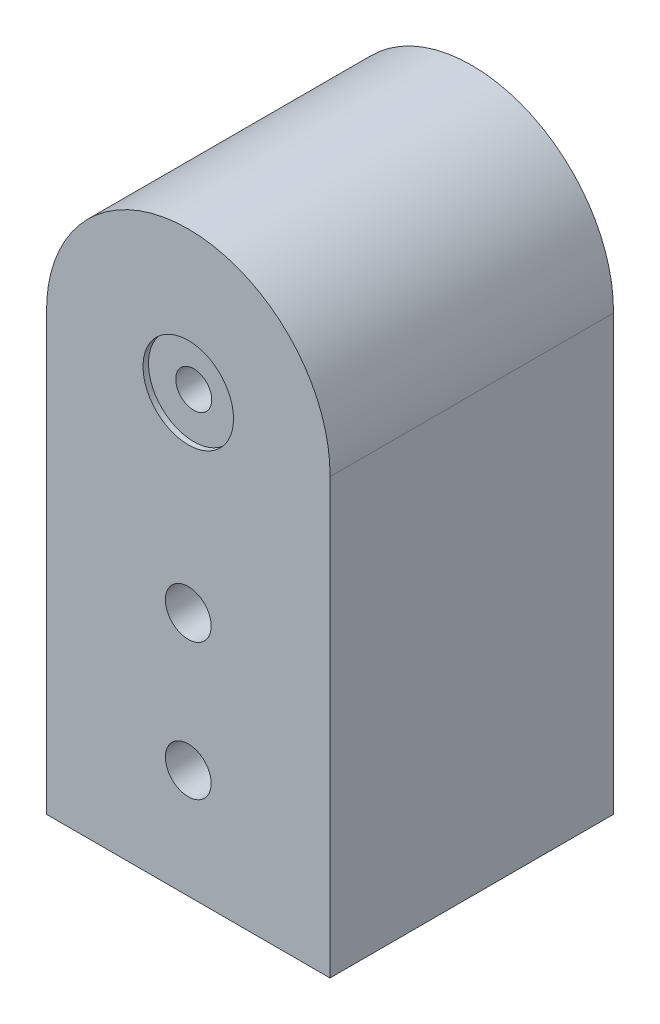
ISO-10303-21;
HEADER;
FILE_DESCRIPTION(('STEP AP214'),'2;1');
FILE_NAME('part.step','',(''),(''),'','','');
FILE_SCHEMA(('AUTOMOTIVE_DESIGN { 1 0 10303 214 1 1 1 1 }'));
ENDSEC;
DATA;
#1=APPLICATION_CONTEXT('core data for automotive mechanical design processes');
#2=APPLICATION_PROTOCOL_DEFINITION('international standard','automotive_design',2000,#1);
#3=PRODUCT_CONTEXT('',#1,'mechanical');
#4=PRODUCT('Part','Part','',(#3));
#5=PRODUCT_RELATED_PRODUCT_CATEGORY('part','',(#4));
#6=PRODUCT_DEFINITION_FORMATION('','',#4);
#7=PRODUCT_DEFINITION_CONTEXT('part definition',#1,'design');
#8=PRODUCT_DEFINITION('design','',#6,#7);
#9=PRODUCT_DEFINITION_SHAPE('','',#8);
#10=(LENGTH_UNIT() NAMED_UNIT(*) SI_UNIT(.MILLI.,.METRE.));
#11=(NAMED_UNIT(*) PLANE_ANGLE_UNIT() SI_UNIT($,.RADIAN.));
#12=(NAMED_UNIT(*) SI_UNIT($,.STERADIAN.) SOLID_ANGLE_UNIT());
#13=UNCERTAINTY_MEASURE_WITH_UNIT(LENGTH_MEASURE(1.E-05),#10,'distance_accuracy_value','');
#14=(GEOMETRIC_REPRESENTATION_CONTEXT(3) GLOBAL_UNCERTAINTY_ASSIGNED_CONTEXT((#13)) GLOBAL_UNIT_ASSIGNED_CONTEXT((#10,
#11,#12)) REPRESENTATION_CONTEXT('',''));
#15=CARTESIAN_POINT('',(0.,0.,0.));
#16=DIRECTION('',(0.,0.,1.));
#17=DIRECTION('',(1.,0.,0.));
#18=AXIS2_PLACEMENT_3D('',#15,#16,#17);
#19=CARTESIAN_POINT('',(13.,40.,0.));
#20=DIRECTION('',(0.,0.,1.));
#21=DIRECTION('',(1.,0.,0.));
#22=AXIS2_PLACEMENT_3D('',#19,#20,#21);
#23=CYLINDRICAL_SURFACE('',#22,1.65);
#24=CARTESIAN_POINT('',(13.,40.,25.5));
#25=DIRECTION('',(0.,0.,1.));
#26=DIRECTION('',(1.,0.,0.));
#27=AXIS2_PLACEMENT_3D('',#24,#25,#26);
#28=CIRCLE('',#27,1.65);
#29=CARTESIAN_POINT('',(14.65,40.,25.5));
#30=VERTEX_POINT('',#29);
#31=EDGE_CURVE('E150',#30,#30,#28,.T.);
#32=CARTESIAN_POINT('',(13.,40.,0.5));
#33=DIRECTION('',(0.,0.,-1.));
#34=DIRECTION('',(-1.,0.,0.));
#35=AXIS2_PLACEMENT_3D('',#32,#33,#34);
#36=CIRCLE('',#35,1.65);
#37=CARTESIAN_POINT('',(14.65,40.,0.5));
#38=VERTEX_POINT('',#37);
#39=EDGE_CURVE('E143',#38,#38,#36,.T.);
#40=CARTESIAN_POINT('',(14.65,40.,25.5));
#41=CARTESIAN_POINT('',(14.65,40.,25.2395833333333));
#42=CARTESIAN_POINT('',(14.65,40.,24.9791666666667));
#43=CARTESIAN_POINT('',(14.65,40.,24.4583333333333));
#44=CARTESIAN_POINT('',(14.65,40.,24.1979166666667));
#45=CARTESIAN_POINT('',(14.65,40.,23.6770833333333));
#46=CARTESIAN_POINT('',(14.65,40.,23.4166666666667));
#47=CARTESIAN_POINT('',(14.65,40.,22.8958333333333));
#48=CARTESIAN_POINT('',(14.65,40.,22.6354166666667));
#49=CARTESIAN_POINT('',(14.65,40.,22.1145833333333));
#50=CARTESIAN_POINT('',(14.65,40.,21.8541666666667));
#51=CARTESIAN_POINT('',(14.65,40.,21.3333333333333));
#52=CARTESIAN_POINT('',(14.65,40.,21.0729166666667));
#53=CARTESIAN_POINT('',(14.65,40.,20.5520833333333));
#54=CARTESIAN_POINT('',(14.65,40.,20.2916666666667));
#55=CARTESIAN_POINT('',(14.65,40.,19.7708333333333));
#56=CARTESIAN_POINT('',(14.65,40.,19.5104166666667));
#57=CARTESIAN_POINT('',(14.65,40.,18.9895833333333));
#58=CARTESIAN_POINT('',(14.65,40.,18.7291666666667));
#59=CARTESIAN_POINT('',(14.65,40.,18.2083333333333));
#60=CARTESIAN_POINT('',(14.65,40.,17.9479166666667));
#61=CARTESIAN_POINT('',(14.65,40.,17.4270833333333));
#62=CARTESIAN_POINT('',(14.65,40.,17.1666666666667));
#63=CARTESIAN_POINT('',(14.65,40.,16.6458333333333));
#64=CARTESIAN_POINT('',(14.65,40.,16.3854166666667));
#65=CARTESIAN_POINT('',(14.65,40.,15.8645833333333));
#66=CARTESIAN_POINT('',(14.65,40.,15.6041666666667));
#67=CARTESIAN_POINT('',(14.65,40.,15.0833333333333));
#68=CARTESIAN_POINT('',(14.65,40.,14.8229166666667));
#69=CARTESIAN_POINT('',(14.65,40.,14.3020833333333));
#70=CARTESIAN_POINT('',(14.65,40.,14.0416666666667));
#71=CARTESIAN_POINT('',(14.65,40.,13.5208333333333));
#72=CARTESIAN_POINT('',(14.65,40.,13.2604166666667));
#73=CARTESIAN_POINT('',(14.65,40.,12.7395833333333));
#74=CARTESIAN_POINT('',(14.65,40.,12.4791666666667));
#75=CARTESIAN_POINT('',(14.65,40.,11.9583333333333));
#76=CARTESIAN_POINT('',(14.65,40.,11.6979166666667));
#77=CARTESIAN_POINT('',(14.65,40.,11.1770833333333));
#78=CARTESIAN_POINT('',(14.65,40.,10.9166666666667));
#79=CARTESIAN_POINT('',(14.65,40.,10.3958333333333));
#80=CARTESIAN_POINT('',(14.65,40.,10.1354166666667));
#81=CARTESIAN_POINT('',(14.65,40.,9.61458333333333));
#82=CARTESIAN_POINT('',(14.65,40.,9.35416666666667));
#83=CARTESIAN_POINT('',(14.65,40.,8.83333333333333));
#84=CARTESIAN_POINT('',(14.65,40.,8.57291666666667));
#85=CARTESIAN_POINT('',(14.65,40.,8.05208333333333));
#86=CARTESIAN_POINT('',(14.65,40.,7.79166666666667));
#87=CARTESIAN_POINT('',(14.65,40.,7.27083333333333));
#88=CARTESIAN_POINT('',(14.65,40.,7.01041666666667));
#89=CARTESIAN_POINT('',(14.65,40.,6.48958333333333));
#90=CARTESIAN_POINT('',(14.65,40.,6.22916666666667));
#91=CARTESIAN_POINT('',(14.65,40.,5.70833333333333));
#92=CARTESIAN_POINT('',(14.65,40.,5.44791666666667));
#93=CARTESIAN_POINT('',(14.65,40.,4.92708333333333));
#94=CARTESIAN_POINT('',(14.65,40.,4.66666666666667));
#95=CARTESIAN_POINT('',(14.65,40.,4.14583333333333));
#96=CARTESIAN_POINT('',(14.65,40.,3.88541666666667));
#97=CARTESIAN_POINT('',(14.65,40.,3.36458333333333));
#98=CARTESIAN_POINT('',(14.65,40.,3.10416666666667));
#99=CARTESIAN_POINT('',(14.65,40.,2.58333333333333));
#100=CARTESIAN_POINT('',(14.65,40.,2.32291666666667));
#101=CARTESIAN_POINT('',(14.65,40.,1.80208333333333));
#102=CARTESIAN_POINT('',(14.65,40.,1.54166666666667));
#103=CARTESIAN_POINT('',(14.65,40.,1.02083333333333));
#104=CARTESIAN_POINT('',(14.65,40.,0.760416666666668));
#105=CARTESIAN_POINT('',(14.65,40.,0.5));
#106=B_SPLINE_CURVE_WITH_KNOTS('',3,(#40,#41,#42,#43,#44,#45,#46,#47,#48,#49,#50,#51,#52,#53,
#54,#55,#56,#57,#58,#59,#60,#61,#62,#63,#64,#65,#66,#67,#68,#69,#70,#71,#72,#73,#74,#75,#76,#77,
#78,#79,#80,#81,#82,#83,#84,#85,#86,#87,#88,#89,#90,#91,#92,#93,#94,#95,#96,#97,#98,#99,#100,
#101,#102,#103,#104,#105),.UNSPECIFIED.,.F.,.F.,(4,2,2,2,2,2,2,2,2,2,2,2,2,2,2,2,2,2,2,2,2,2,2,
2,2,2,2,2,2,2,2,2,4),(0.,0.781250000000001,1.5625,2.34375,3.125,3.90625,4.6875,5.46875,6.25,
7.03125,7.8125,8.59375,9.375,10.15625,10.9375,11.71875,12.5,13.28125,14.0625,14.84375,15.625,
16.40625,17.1875,17.96875,18.75,19.53125,20.3125,21.09375,21.875,22.65625,23.4375,24.21875,25.),.UNSPECIFIED.);
#107=EDGE_CURVE('BSEAM34',#30,#38,#106,.T.);
#108=ORIENTED_EDGE('',*,*,#31,.T.);
#109=ORIENTED_EDGE('',*,*,#39,.T.);
#110=ORIENTED_EDGE('',*,*,#107,.T.);
#111=ORIENTED_EDGE('',*,*,#107,.F.);
#112=EDGE_LOOP('',(#108,#110,#109,#111));
#113=FACE_BOUND('',#112,.T.);
#114=ADVANCED_FACE('F34',(#113),#23,.F.);
#115=CARTESIAN_POINT('',(26.,0.,26.));
#116=DIRECTION('',(0.,1.,0.));
#117=DIRECTION('',(0.,0.,1.));
#118=AXIS2_PLACEMENT_3D('',#115,#116,#117);
#119=PLANE('',#118);
#120=DIRECTION('',(1.,0.,0.));
#121=VECTOR('',#120,1.);
#122=CARTESIAN_POINT('',(3.,0.,3.));
#123=LINE('',#122,#121);
#124=CARTESIAN_POINT('',(3.,0.,3.));
#125=VERTEX_POINT('',#124);
#126=CARTESIAN_POINT('',(23.,0.,3.));
#127=VERTEX_POINT('',#126);
#128=EDGE_CURVE('E176',#125,#127,#123,.T.);
#129=ORIENTED_EDGE('',*,*,#128,.F.);
#130=DIRECTION('',(0.,0.,-1.));
#131=VECTOR('',#130,1.);
#132=CARTESIAN_POINT('',(3.,0.,23.));
#133=LINE('',#132,#131);
#134=CARTESIAN_POINT('',(3.,0.,23.));
#135=VERTEX_POINT('',#134);
#136=EDGE_CURVE('E57',#135,#125,#133,.T.);
#137=ORIENTED_EDGE('',*,*,#136,.F.);
#138=DIRECTION('',(-1.,0.,0.));
#139=VECTOR('',#138,1.);
#140=CARTESIAN_POINT('',(3.,0.,23.));
#141=LINE('',#140,#139);
#142=CARTESIAN_POINT('',(23.,0.,23.));
#143=VERTEX_POINT('',#142);
#144=EDGE_CURVE('E165',#143,#135,#141,.T.);
#145=ORIENTED_EDGE('',*,*,#144,.F.);
#146=DIRECTION('',(0.,0.,1.));
#147=VECTOR('',#146,1.);
#148=CARTESIAN_POINT('',(23.,0.,23.));
#149=LINE('',#148,#147);
#150=EDGE_CURVE('E179',#127,#143,#149,.T.);
#151=ORIENTED_EDGE('',*,*,#150,.F.);
#152=EDGE_LOOP('',(#129,#137,#145,#151));
#153=FACE_BOUND('',#152,.T.);
#154=DIRECTION('',(1.,0.,0.));
#155=VECTOR('',#154,1.);
#156=CARTESIAN_POINT('',(26.,0.,0.));
#157=LINE('',#156,#155);
#158=CARTESIAN_POINT('',(0.,0.,0.));
#159=VERTEX_POINT('',#158);
#160=CARTESIAN_POINT('',(26.,0.,0.));
#161=VERTEX_POINT('',#160);
#162=EDGE_CURVE('E186',#159,#161,#157,.T.);
#163=ORIENTED_EDGE('',*,*,#162,.T.);
#164=DIRECTION('',(0.,0.,-1.));
#165=VECTOR('',#164,1.);
#166=CARTESIAN_POINT('',(26.,0.,26.));
#167=LINE('',#166,#165);
#168=CARTESIAN_POINT('',(26.,0.,26.));
#169=VERTEX_POINT('',#168);
#170=EDGE_CURVE('E42',#169,#161,#167,.T.);
#171=ORIENTED_EDGE('',*,*,#170,.F.);
#172=DIRECTION('',(1.,0.,0.));
#173=VECTOR('',#172,1.);
#174=CARTESIAN_POINT('',(26.,0.,26.));
#175=LINE('',#174,#173);
#176=CARTESIAN_POINT('',(0.,0.,26.));
#177=VERTEX_POINT('',#176);
#178=EDGE_CURVE('E192',#177,#169,#175,.T.);
#179=ORIENTED_EDGE('',*,*,#178,.F.);
#180=DIRECTION('',(0.,0.,-1.));
#181=VECTOR('',#180,1.);
#182=CARTESIAN_POINT('',(0.,0.,26.));
#183=LINE('',#182,#181);
#184=EDGE_CURVE('E104',#177,#159,#183,.T.);
#185=ORIENTED_EDGE('',*,*,#184,.T.);
#186=EDGE_LOOP('',(#163,#171,#179,#185));
#187=FACE_BOUND('',#186,.T.);
#188=ADVANCED_FACE('F36',(#153,#187),#119,.F.);
#189=CARTESIAN_POINT('',(26.,30.,26.));
#190=DIRECTION('',(-1.,0.,0.));
#191=DIRECTION('',(0.,0.,1.));
#192=AXIS2_PLACEMENT_3D('',#189,#190,#191);
#193=PLANE('',#192);
#194=DIRECTION('',(0.,1.,0.));
#195=VECTOR('',#194,1.);
#196=CARTESIAN_POINT('',(26.,30.,0.));
#197=LINE('',#196,#195);
#198=CARTESIAN_POINT('',(26.,39.8219336489554,0.));
#199=VERTEX_POINT('',#198);
#200=EDGE_CURVE('E197',#161,#199,#197,.T.);
#201=ORIENTED_EDGE('',*,*,#200,.T.);
#202=DIRECTION('',(0.,0.,1.));
#203=VECTOR('',#202,1.);
#204=CARTESIAN_POINT('',(26.,39.8219336489554,-41.));
#205=LINE('',#204,#203);
#206=CARTESIAN_POINT('',(26.,39.8219336489554,26.));
#207=VERTEX_POINT('',#206);
#208=EDGE_CURVE('E116',#199,#207,#205,.T.);
#209=ORIENTED_EDGE('',*,*,#208,.T.);
#210=DIRECTION('',(0.,1.,0.));
#211=VECTOR('',#210,1.);
#212=CARTESIAN_POINT('',(26.,30.,26.));
#213=LINE('',#212,#211);
#214=EDGE_CURVE('E109',#169,#207,#213,.T.);
#215=ORIENTED_EDGE('',*,*,#214,.F.);
#216=ORIENTED_EDGE('',*,*,#170,.T.);
#217=EDGE_LOOP('',(#201,#209,#215,#216));
#218=FACE_BOUND('',#217,.T.);
#219=ADVANCED_FACE('F235',(#218),#193,.F.);
#220=CARTESIAN_POINT('',(0.,0.,26.));
#221=DIRECTION('',(1.,0.,0.));
#222=DIRECTION('',(0.,0.,-1.));
#223=AXIS2_PLACEMENT_3D('',#220,#221,#222);
#224=PLANE('',#223);
#225=DIRECTION('',(0.,-1.,0.));
#226=VECTOR('',#225,1.);
#227=CARTESIAN_POINT('',(0.,0.,0.));
#228=LINE('',#227,#226);
#229=CARTESIAN_POINT('',(0.,39.821933648956,0.));
#230=VERTEX_POINT('',#229);
#231=EDGE_CURVE('E49',#230,#159,#228,.T.);
#232=ORIENTED_EDGE('',*,*,#231,.T.);
#233=ORIENTED_EDGE('',*,*,#184,.F.);
#234=DIRECTION('',(0.,-1.,0.));
#235=VECTOR('',#234,1.);
#236=CARTESIAN_POINT('',(0.,0.,26.));
#237=LINE('',#236,#235);
#238=CARTESIAN_POINT('',(0.,39.821933648956,26.));
#239=VERTEX_POINT('',#238);
#240=EDGE_CURVE('E99',#239,#177,#237,.T.);
#241=ORIENTED_EDGE('',*,*,#240,.F.);
#242=DIRECTION('',(0.,0.,1.));
#243=VECTOR('',#242,1.);
#244=CARTESIAN_POINT('',(0.,39.821933648956,-41.));
#245=LINE('',#244,#243);
#246=EDGE_CURVE('E102',#230,#239,#245,.T.);
#247=ORIENTED_EDGE('',*,*,#246,.F.);
#248=EDGE_LOOP('',(#232,#233,#241,#247));
#249=FACE_BOUND('',#248,.T.);
#250=ADVANCED_FACE('F101',(#249),#224,.F.);
#251=CARTESIAN_POINT('',(13.,40.,26.));
#252=DIRECTION('',(0.,0.,-1.));
#253=DIRECTION('',(-1.,0.,0.));
#254=AXIS2_PLACEMENT_3D('',#251,#252,#253);
#255=PLANE('',#254);
#256=CARTESIAN_POINT('',(13.,22.5,26.));
#257=DIRECTION('',(0.,0.,1.));
#258=DIRECTION('',(1.,0.,0.));
#259=AXIS2_PLACEMENT_3D('',#256,#257,#258);
#260=CIRCLE('',#259,2.1);
#261=CARTESIAN_POINT('',(15.1,22.5,26.));
#262=VERTEX_POINT('',#261);
#263=EDGE_CURVE('E128',#262,#262,#260,.T.);
#264=ORIENTED_EDGE('',*,*,#263,.F.);
#265=EDGE_LOOP('',(#264));
#266=FACE_BOUND('',#265,.T.);
#267=CARTESIAN_POINT('',(13.,10.,26.));
#268=DIRECTION('',(0.,0.,1.));
#269=DIRECTION('',(1.,0.,0.));
#270=AXIS2_PLACEMENT_3D('',#267,#268,#269);
#271=CIRCLE('',#270,2.1);
#272=CARTESIAN_POINT('',(15.1,10.,26.));
#273=VERTEX_POINT('',#272);
#274=EDGE_CURVE('E122',#273,#273,#271,.T.);
#275=ORIENTED_EDGE('',*,*,#274,.F.);
#276=EDGE_LOOP('',(#275));
#277=FACE_BOUND('',#276,.T.);
#278=CARTESIAN_POINT('',(13.,40.,26.));
#279=DIRECTION('',(0.,0.,1.));
#280=DIRECTION('',(1.,0.,0.));
#281=AXIS2_PLACEMENT_3D('',#278,#279,#280);
#282=CIRCLE('',#281,4.15);
#283=CARTESIAN_POINT('',(17.15,40.,26.));
#284=VERTEX_POINT('',#283);
#285=EDGE_CURVE('E155',#284,#284,#282,.T.);
#286=ORIENTED_EDGE('',*,*,#285,.F.);
#287=EDGE_LOOP('',(#286));
#288=FACE_BOUND('',#287,.T.);
#289=ORIENTED_EDGE('',*,*,#214,.T.);
#290=CARTESIAN_POINT('',(13.,40.,26.));
#291=DIRECTION('',(0.,0.,-1.));
#292=DIRECTION('',(1.,0.,0.));
#293=AXIS2_PLACEMENT_3D('',#290,#291,#292);
#294=CIRCLE('',#293,13.0012194668567);
#295=EDGE_CURVE('E115',#239,#207,#294,.T.);
#296=ORIENTED_EDGE('',*,*,#295,.F.);
#297=ORIENTED_EDGE('',*,*,#240,.T.);
#298=ORIENTED_EDGE('',*,*,#178,.T.);
#299=EDGE_LOOP('',(#289,#296,#297,#298));
#300=FACE_BOUND('',#299,.T.);
#301=ADVANCED_FACE('F118',(#266,#277,#288,#300),#255,.F.);
#302=CARTESIAN_POINT('',(13.,40.,0.));
#303=DIRECTION('',(0.,0.,-1.));
#304=DIRECTION('',(-1.,0.,0.));
#305=AXIS2_PLACEMENT_3D('',#302,#303,#304);
#306=PLANE('',#305);
#307=CARTESIAN_POINT('',(13.,40.,0.));
#308=DIRECTION('',(0.,0.,-1.));
#309=DIRECTION('',(-1.,0.,0.));
#310=AXIS2_PLACEMENT_3D('',#307,#308,#309);
#311=CIRCLE('',#310,13.0012194668567);
#312=EDGE_CURVE('E11',#199,#230,#311,.F.);
#313=ORIENTED_EDGE('',*,*,#312,.F.);
#314=ORIENTED_EDGE('',*,*,#200,.F.);
#315=ORIENTED_EDGE('',*,*,#162,.F.);
#316=ORIENTED_EDGE('',*,*,#231,.F.);
#317=EDGE_LOOP('',(#313,#314,#315,#316));
#318=FACE_BOUND('',#317,.T.);
#319=CARTESIAN_POINT('',(13.,22.5,0.));
#320=DIRECTION('',(0.,0.,1.));
#321=DIRECTION('',(1.,0.,0.));
#322=AXIS2_PLACEMENT_3D('',#319,#320,#321);
#323=CIRCLE('',#322,2.1);
#324=CARTESIAN_POINT('',(15.1,22.5,0.));
#325=VERTEX_POINT('',#324);
#326=EDGE_CURVE('E124',#325,#325,#323,.T.);
#327=ORIENTED_EDGE('',*,*,#326,.T.);
#328=EDGE_LOOP('',(#327));
#329=FACE_BOUND('',#328,.T.);
#330=CARTESIAN_POINT('',(13.,10.,0.));
#331=DIRECTION('',(0.,0.,1.));
#332=DIRECTION('',(1.,0.,0.));
#333=AXIS2_PLACEMENT_3D('',#330,#331,#332);
#334=CIRCLE('',#333,2.1);
#335=CARTESIAN_POINT('',(15.1,10.,0.));
#336=VERTEX_POINT('',#335);
#337=EDGE_CURVE('E131',#336,#336,#334,.T.);
#338=ORIENTED_EDGE('',*,*,#337,.T.);
#339=EDGE_LOOP('',(#338));
#340=FACE_BOUND('',#339,.T.);
#341=CARTESIAN_POINT('',(13.,40.,0.));
#342=DIRECTION('',(0.,0.,-1.));
#343=DIRECTION('',(-1.,0.,0.));
#344=AXIS2_PLACEMENT_3D('',#341,#342,#343);
#345=CIRCLE('',#344,4.15);
#346=CARTESIAN_POINT('',(8.85,40.,0.));
#347=VERTEX_POINT('',#346);
#348=EDGE_CURVE('E146',#347,#347,#345,.T.);
#349=ORIENTED_EDGE('',*,*,#348,.F.);
#350=EDGE_LOOP('',(#349));
#351=FACE_BOUND('',#350,.T.);
#352=ADVANCED_FACE('F259',(#318,#329,#340,#351),#306,.T.);
#353=CARTESIAN_POINT('',(3.,30.,23.));
#354=DIRECTION('',(-1.,0.,0.));
#355=DIRECTION('',(0.,0.,1.));
#356=AXIS2_PLACEMENT_3D('',#353,#354,#355);
#357=PLANE('',#356);
#358=ORIENTED_EDGE('',*,*,#136,.T.);
#359=DIRECTION('',(0.,-1.,0.));
#360=VECTOR('',#359,1.);
#361=CARTESIAN_POINT('',(3.,30.,3.));
#362=LINE('',#361,#360);
#363=CARTESIAN_POINT('',(3.,30.,3.));
#364=VERTEX_POINT('',#363);
#365=EDGE_CURVE('E174',#364,#125,#362,.T.);
#366=ORIENTED_EDGE('',*,*,#365,.F.);
#367=DIRECTION('',(0.,0.,-1.));
#368=VECTOR('',#367,1.);
#369=CARTESIAN_POINT('',(3.,30.,23.));
#370=LINE('',#369,#368);
#371=CARTESIAN_POINT('',(3.,30.,23.));
#372=VERTEX_POINT('',#371);
#373=EDGE_CURVE('E161',#372,#364,#370,.T.);
#374=ORIENTED_EDGE('',*,*,#373,.F.);
#375=DIRECTION('',(0.,-1.,0.));
#376=VECTOR('',#375,1.);
#377=CARTESIAN_POINT('',(3.,30.,23.));
#378=LINE('',#377,#376);
#379=EDGE_CURVE('E184',#372,#135,#378,.T.);
#380=ORIENTED_EDGE('',*,*,#379,.T.);
#381=EDGE_LOOP('',(#358,#366,#374,#380));
#382=FACE_BOUND('',#381,.T.);
#383=ADVANCED_FACE('F250',(#382),#357,.F.);
#384=CARTESIAN_POINT('',(3.,30.,23.));
#385=DIRECTION('',(0.,0.,1.));
#386=DIRECTION('',(1.,0.,0.));
#387=AXIS2_PLACEMENT_3D('',#384,#385,#386);
#388=PLANE('',#387);
#389=CARTESIAN_POINT('',(13.,22.5,23.));
#390=DIRECTION('',(0.,0.,1.));
#391=DIRECTION('',(1.,0.,0.));
#392=AXIS2_PLACEMENT_3D('',#389,#390,#391);
#393=CIRCLE('',#392,2.1);
#394=CARTESIAN_POINT('',(15.1,22.5,23.));
#395=VERTEX_POINT('',#394);
#396=EDGE_CURVE('E140',#395,#395,#393,.T.);
#397=ORIENTED_EDGE('',*,*,#396,.T.);
#398=EDGE_LOOP('',(#397));
#399=FACE_BOUND('',#398,.T.);
#400=CARTESIAN_POINT('',(13.,10.,23.));
#401=DIRECTION('',(0.,0.,1.));
#402=DIRECTION('',(1.,0.,0.));
#403=AXIS2_PLACEMENT_3D('',#400,#401,#402);
#404=CIRCLE('',#403,2.1);
#405=CARTESIAN_POINT('',(15.1,10.,23.));
#406=VERTEX_POINT('',#405);
#407=EDGE_CURVE('E136',#406,#406,#404,.T.);
#408=ORIENTED_EDGE('',*,*,#407,.T.);
#409=EDGE_LOOP('',(#408));
#410=FACE_BOUND('',#409,.T.);
#411=ORIENTED_EDGE('',*,*,#144,.T.);
#412=ORIENTED_EDGE('',*,*,#379,.F.);
#413=DIRECTION('',(-1.,0.,0.));
#414=VECTOR('',#413,1.);
#415=CARTESIAN_POINT('',(3.,30.,23.));
#416=LINE('',#415,#414);
#417=CARTESIAN_POINT('',(23.,30.,23.));
#418=VERTEX_POINT('',#417);
#419=EDGE_CURVE('E171',#418,#372,#416,.T.);
#420=ORIENTED_EDGE('',*,*,#419,.F.);
#421=DIRECTION('',(0.,-1.,0.));
#422=VECTOR('',#421,1.);
#423=CARTESIAN_POINT('',(23.,30.,23.));
#424=LINE('',#423,#422);
#425=EDGE_CURVE('E187',#418,#143,#424,.T.);
#426=ORIENTED_EDGE('',*,*,#425,.T.);
#427=EDGE_LOOP('',(#411,#412,#420,#426));
#428=FACE_BOUND('',#427,.T.);
#429=ADVANCED_FACE('F246',(#399,#410,#428),#388,.F.);
#430=CARTESIAN_POINT('',(23.,30.,23.));
#431=DIRECTION('',(1.,0.,0.));
#432=DIRECTION('',(0.,0.,-1.));
#433=AXIS2_PLACEMENT_3D('',#430,#431,#432);
#434=PLANE('',#433);
#435=ORIENTED_EDGE('',*,*,#150,.T.);
#436=ORIENTED_EDGE('',*,*,#425,.F.);
#437=DIRECTION('',(0.,0.,1.));
#438=VECTOR('',#437,1.);
#439=CARTESIAN_POINT('',(23.,30.,23.));
#440=LINE('',#439,#438);
#441=CARTESIAN_POINT('',(23.,30.,3.));
#442=VERTEX_POINT('',#441);
#443=EDGE_CURVE('E168',#442,#418,#440,.T.);
#444=ORIENTED_EDGE('',*,*,#443,.F.);
#445=DIRECTION('',(0.,-1.,0.));
#446=VECTOR('',#445,1.);
#447=CARTESIAN_POINT('',(23.,30.,3.));
#448=LINE('',#447,#446);
#449=EDGE_CURVE('E189',#442,#127,#448,.T.);
#450=ORIENTED_EDGE('',*,*,#449,.T.);
#451=EDGE_LOOP('',(#435,#436,#444,#450));
#452=FACE_BOUND('',#451,.T.);
#453=ADVANCED_FACE('F249',(#452),#434,.F.);
#454=CARTESIAN_POINT('',(3.,30.,3.));
#455=DIRECTION('',(0.,0.,-1.));
#456=DIRECTION('',(-1.,0.,0.));
#457=AXIS2_PLACEMENT_3D('',#454,#455,#456);
#458=PLANE('',#457);
#459=CARTESIAN_POINT('',(13.,22.5,3.));
#460=DIRECTION('',(0.,0.,-1.));
#461=DIRECTION('',(-1.,0.,0.));
#462=AXIS2_PLACEMENT_3D('',#459,#460,#461);
#463=CIRCLE('',#462,2.1);
#464=CARTESIAN_POINT('',(15.1,22.5,3.));
#465=VERTEX_POINT('',#464);
#466=EDGE_CURVE('E139',#465,#465,#463,.T.);
#467=ORIENTED_EDGE('',*,*,#466,.T.);
#468=EDGE_LOOP('',(#467));
#469=FACE_BOUND('',#468,.T.);
#470=CARTESIAN_POINT('',(13.,10.,3.));
#471=DIRECTION('',(0.,0.,-1.));
#472=DIRECTION('',(-1.,0.,0.));
#473=AXIS2_PLACEMENT_3D('',#470,#471,#472);
#474=CIRCLE('',#473,2.1);
#475=CARTESIAN_POINT('',(15.1,10.,3.));
#476=VERTEX_POINT('',#475);
#477=EDGE_CURVE('E127',#476,#476,#474,.T.);
#478=ORIENTED_EDGE('',*,*,#477,.T.);
#479=EDGE_LOOP('',(#478));
#480=FACE_BOUND('',#479,.T.);
#481=ORIENTED_EDGE('',*,*,#128,.T.);
#482=ORIENTED_EDGE('',*,*,#449,.F.);
#483=DIRECTION('',(1.,0.,0.));
#484=VECTOR('',#483,1.);
#485=CARTESIAN_POINT('',(3.,30.,3.));
#486=LINE('',#485,#484);
#487=EDGE_CURVE('E164',#364,#442,#486,.T.);
#488=ORIENTED_EDGE('',*,*,#487,.F.);
#489=ORIENTED_EDGE('',*,*,#365,.T.);
#490=EDGE_LOOP('',(#481,#482,#488,#489));
#491=FACE_BOUND('',#490,.T.);
#492=ADVANCED_FACE('F207',(#469,#480,#491),#458,.F.);
#493=CARTESIAN_POINT('',(0.,30.,0.));
#494=DIRECTION('',(0.,-1.,0.));
#495=DIRECTION('',(0.,0.,-1.));
#496=AXIS2_PLACEMENT_3D('',#493,#494,#495);
#497=PLANE('',#496);
#498=ORIENTED_EDGE('',*,*,#373,.T.);
#499=ORIENTED_EDGE('',*,*,#487,.T.);
#500=ORIENTED_EDGE('',*,*,#443,.T.);
#501=ORIENTED_EDGE('',*,*,#419,.T.);
#502=EDGE_LOOP('',(#498,#499,#500,#501));
#503=FACE_BOUND('',#502,.T.);
#504=ADVANCED_FACE('F242',(#503),#497,.T.);
#505=CARTESIAN_POINT('',(13.,40.,25.5));
#506=DIRECTION('',(0.,0.,1.));
#507=DIRECTION('',(1.,0.,0.));
#508=AXIS2_PLACEMENT_3D('',#505,#506,#507);
#509=CYLINDRICAL_SURFACE('',#508,4.15);
#510=CARTESIAN_POINT('',(13.,40.,25.5));
#511=DIRECTION('',(0.,0.,1.));
#512=DIRECTION('',(1.,0.,0.));
#513=AXIS2_PLACEMENT_3D('',#510,#511,#512);
#514=CIRCLE('',#513,4.15);
#515=CARTESIAN_POINT('',(17.15,40.,25.5));
#516=VERTEX_POINT('',#515);
#517=EDGE_CURVE('E156',#516,#516,#514,.T.);
#518=ORIENTED_EDGE('',*,*,#517,.F.);
#519=EDGE_LOOP('',(#518));
#520=FACE_BOUND('',#519,.T.);
#521=ORIENTED_EDGE('',*,*,#285,.T.);
#522=EDGE_LOOP('',(#521));
#523=FACE_BOUND('',#522,.T.);
#524=ADVANCED_FACE('F240',(#520,#523),#509,.F.);
#525=CARTESIAN_POINT('',(13.,40.,25.5));
#526=DIRECTION('',(0.,0.,1.));
#527=DIRECTION('',(1.,0.,0.));
#528=AXIS2_PLACEMENT_3D('',#525,#526,#527);
#529=PLANE('',#528);
#530=ORIENTED_EDGE('',*,*,#31,.F.);
#531=EDGE_LOOP('',(#530));
#532=FACE_BOUND('',#531,.T.);
#533=ORIENTED_EDGE('',*,*,#517,.T.);
#534=EDGE_LOOP('',(#533));
#535=FACE_BOUND('',#534,.T.);
#536=ADVANCED_FACE('F279',(#532,#535),#529,.T.);
#537=CARTESIAN_POINT('',(13.,40.,0.5));
#538=DIRECTION('',(0.,0.,-1.));
#539=DIRECTION('',(-1.,0.,0.));
#540=AXIS2_PLACEMENT_3D('',#537,#538,#539);
#541=CYLINDRICAL_SURFACE('',#540,4.15);
#542=CARTESIAN_POINT('',(13.,40.,0.5));
#543=DIRECTION('',(0.,0.,-1.));
#544=DIRECTION('',(-1.,0.,0.));
#545=AXIS2_PLACEMENT_3D('',#542,#543,#544);
#546=CIRCLE('',#545,4.15);
#547=CARTESIAN_POINT('',(8.85,40.,0.5));
#548=VERTEX_POINT('',#547);
#549=EDGE_CURVE('E147',#548,#548,#546,.T.);
#550=ORIENTED_EDGE('',*,*,#549,.F.);
#551=EDGE_LOOP('',(#550));
#552=FACE_BOUND('',#551,.T.);
#553=ORIENTED_EDGE('',*,*,#348,.T.);
#554=EDGE_LOOP('',(#553));
#555=FACE_BOUND('',#554,.T.);
#556=ADVANCED_FACE('F277',(#552,#555),#541,.F.);
#557=CARTESIAN_POINT('',(13.,40.,0.5));
#558=DIRECTION('',(0.,0.,-1.));
#559=DIRECTION('',(-1.,0.,0.));
#560=AXIS2_PLACEMENT_3D('',#557,#558,#559);
#561=PLANE('',#560);
#562=ORIENTED_EDGE('',*,*,#39,.F.);
#563=EDGE_LOOP('',(#562));
#564=FACE_BOUND('',#563,.T.);
#565=ORIENTED_EDGE('',*,*,#549,.T.);
#566=EDGE_LOOP('',(#565));
#567=FACE_BOUND('',#566,.T.);
#568=ADVANCED_FACE('F223',(#564,#567),#561,.T.);
#569=CARTESIAN_POINT('',(13.,10.,0.));
#570=DIRECTION('',(0.,0.,1.));
#571=DIRECTION('',(1.,0.,0.));
#572=AXIS2_PLACEMENT_3D('',#569,#570,#571);
#573=CYLINDRICAL_SURFACE('',#572,2.1);
#574=CARTESIAN_POINT('',(15.1,10.,0.));
#575=CARTESIAN_POINT('',(15.1,10.,0.03125));
#576=CARTESIAN_POINT('',(15.1,10.,0.0625));
#577=CARTESIAN_POINT('',(15.1,10.,0.125));
#578=CARTESIAN_POINT('',(15.1,10.,0.15625));
#579=CARTESIAN_POINT('',(15.1,10.,0.21875));
#580=CARTESIAN_POINT('',(15.1,10.,0.25));
#581=CARTESIAN_POINT('',(15.1,10.,0.3125));
#582=CARTESIAN_POINT('',(15.1,10.,0.34375));
#583=CARTESIAN_POINT('',(15.1,10.,0.40625));
#584=CARTESIAN_POINT('',(15.1,10.,0.4375));
#585=CARTESIAN_POINT('',(15.1,10.,0.5));
#586=CARTESIAN_POINT('',(15.1,10.,0.53125));
#587=CARTESIAN_POINT('',(15.1,10.,0.59375));
#588=CARTESIAN_POINT('',(15.1,10.,0.625));
#589=CARTESIAN_POINT('',(15.1,10.,0.6875));
#590=CARTESIAN_POINT('',(15.1,10.,0.71875));
#591=CARTESIAN_POINT('',(15.1,10.,0.78125));
#592=CARTESIAN_POINT('',(15.1,10.,0.8125));
#593=CARTESIAN_POINT('',(15.1,10.,0.875));
#594=CARTESIAN_POINT('',(15.1,10.,0.90625));
#595=CARTESIAN_POINT('',(15.1,10.,0.96875));
#596=CARTESIAN_POINT('',(15.1,10.,1.));
#597=CARTESIAN_POINT('',(15.1,10.,1.0625));
#598=CARTESIAN_POINT('',(15.1,10.,1.09375));
#599=CARTESIAN_POINT('',(15.1,10.,1.15625));
#600=CARTESIAN_POINT('',(15.1,10.,1.1875));
#601=CARTESIAN_POINT('',(15.1,10.,1.25));
#602=CARTESIAN_POINT('',(15.1,10.,1.28125));
#603=CARTESIAN_POINT('',(15.1,10.,1.34375));
#604=CARTESIAN_POINT('',(15.1,10.,1.375));
#605=CARTESIAN_POINT('',(15.1,10.,1.4375));
#606=CARTESIAN_POINT('',(15.1,10.,1.46875));
#607=CARTESIAN_POINT('',(15.1,10.,1.53125));
#608=CARTESIAN_POINT('',(15.1,10.,1.5625));
#609=CARTESIAN_POINT('',(15.1,10.,1.625));
#610=CARTESIAN_POINT('',(15.1,10.,1.65625));
#611=CARTESIAN_POINT('',(15.1,10.,1.71875));
#612=CARTESIAN_POINT('',(15.1,10.,1.75));
#613=CARTESIAN_POINT('',(15.1,10.,1.8125));
#614=CARTESIAN_POINT('',(15.1,10.,1.84375));
#615=CARTESIAN_POINT('',(15.1,10.,1.90625));
#616=CARTESIAN_POINT('',(15.1,10.,1.9375));
#617=CARTESIAN_POINT('',(15.1,10.,2.));
#618=CARTESIAN_POINT('',(15.1,10.,2.03125));
#619=CARTESIAN_POINT('',(15.1,10.,2.09375));
#620=CARTESIAN_POINT('',(15.1,10.,2.125));
#621=CARTESIAN_POINT('',(15.1,10.,2.1875));
#622=CARTESIAN_POINT('',(15.1,10.,2.21875));
#623=CARTESIAN_POINT('',(15.1,10.,2.28125));
#624=CARTESIAN_POINT('',(15.1,10.,2.3125));
#625=CARTESIAN_POINT('',(15.1,10.,2.375));
#626=CARTESIAN_POINT('',(15.1,10.,2.40625));
#627=CARTESIAN_POINT('',(15.1,10.,2.46875));
#628=CARTESIAN_POINT('',(15.1,10.,2.5));
#629=CARTESIAN_POINT('',(15.1,10.,2.5625));
#630=CARTESIAN_POINT('',(15.1,10.,2.59375));
#631=CARTESIAN_POINT('',(15.1,10.,2.65625));
#632=CARTESIAN_POINT('',(15.1,10.,2.6875));
#633=CARTESIAN_POINT('',(15.1,10.,2.75));
#634=CARTESIAN_POINT('',(15.1,10.,2.78125));
#635=CARTESIAN_POINT('',(15.1,10.,2.84375));
#636=CARTESIAN_POINT('',(15.1,10.,2.875));
#637=CARTESIAN_POINT('',(15.1,10.,2.9375));
#638=CARTESIAN_POINT('',(15.1,10.,2.96875));
#639=CARTESIAN_POINT('',(15.1,10.,3.));
#640=B_SPLINE_CURVE_WITH_KNOTS('',3,(#574,#575,#576,#577,#578,#579,#580,#581,#582,#583,#584,
#585,#586,#587,#588,#589,#590,#591,#592,#593,#594,#595,#596,#597,#598,#599,#600,#601,#602,#603,
#604,#605,#606,#607,#608,#609,#610,#611,#612,#613,#614,#615,#616,#617,#618,#619,#620,#621,#622,
#623,#624,#625,#626,#627,#628,#629,#630,#631,#632,#633,#634,#635,#636,#637,#638,#639),
.UNSPECIFIED.,.F.,.F.,(4,2,2,2,2,2,2,2,2,2,2,2,2,2,2,2,2,2,2,2,2,2,2,2,2,2,2,2,2,2,2,2,4),(0.,
0.09375,0.1875,0.28125,0.375,0.46875,0.5625,0.65625,0.75,0.84375,0.9375,1.03125,1.125,1.21875,
1.3125,1.40625,1.5,1.59375,1.6875,1.78125,1.875,1.96875,2.0625,2.15625,2.25,2.34375,2.4375,
2.53125,2.625,2.71875,2.8125,2.90625,3.),.UNSPECIFIED.);
#641=EDGE_CURVE('BSEAM213',#336,#476,#640,.T.);
#642=ORIENTED_EDGE('',*,*,#337,.F.);
#643=ORIENTED_EDGE('',*,*,#477,.F.);
#644=ORIENTED_EDGE('',*,*,#641,.T.);
#645=ORIENTED_EDGE('',*,*,#641,.F.);
#646=EDGE_LOOP('',(#642,#644,#643,#645));
#647=FACE_BOUND('',#646,.T.);
#648=ADVANCED_FACE('F213',(#647),#573,.F.);
#649=CARTESIAN_POINT('',(13.,22.5,0.));
#650=DIRECTION('',(0.,0.,1.));
#651=DIRECTION('',(1.,0.,0.));
#652=AXIS2_PLACEMENT_3D('',#649,#650,#651);
#653=CYLINDRICAL_SURFACE('',#652,2.1);
#654=CARTESIAN_POINT('',(15.1,22.5,0.));
#655=CARTESIAN_POINT('',(15.1,22.5,0.03125));
#656=CARTESIAN_POINT('',(15.1,22.5,0.0625));
#657=CARTESIAN_POINT('',(15.1,22.5,0.125));
#658=CARTESIAN_POINT('',(15.1,22.5,0.15625));
#659=CARTESIAN_POINT('',(15.1,22.5,0.21875));
#660=CARTESIAN_POINT('',(15.1,22.5,0.25));
#661=CARTESIAN_POINT('',(15.1,22.5,0.3125));
#662=CARTESIAN_POINT('',(15.1,22.5,0.34375));
#663=CARTESIAN_POINT('',(15.1,22.5,0.40625));
#664=CARTESIAN_POINT('',(15.1,22.5,0.4375));
#665=CARTESIAN_POINT('',(15.1,22.5,0.5));
#666=CARTESIAN_POINT('',(15.1,22.5,0.53125));
#667=CARTESIAN_POINT('',(15.1,22.5,0.59375));
#668=CARTESIAN_POINT('',(15.1,22.5,0.625));
#669=CARTESIAN_POINT('',(15.1,22.5,0.6875));
#670=CARTESIAN_POINT('',(15.1,22.5,0.71875));
#671=CARTESIAN_POINT('',(15.1,22.5,0.78125));
#672=CARTESIAN_POINT('',(15.1,22.5,0.8125));
#673=CARTESIAN_POINT('',(15.1,22.5,0.875));
#674=CARTESIAN_POINT('',(15.1,22.5,0.90625));
#675=CARTESIAN_POINT('',(15.1,22.5,0.96875));
#676=CARTESIAN_POINT('',(15.1,22.5,1.));
#677=CARTESIAN_POINT('',(15.1,22.5,1.0625));
#678=CARTESIAN_POINT('',(15.1,22.5,1.09375));
#679=CARTESIAN_POINT('',(15.1,22.5,1.15625));
#680=CARTESIAN_POINT('',(15.1,22.5,1.1875));
#681=CARTESIAN_POINT('',(15.1,22.5,1.25));
#682=CARTESIAN_POINT('',(15.1,22.5,1.28125));
#683=CARTESIAN_POINT('',(15.1,22.5,1.34375));
#684=CARTESIAN_POINT('',(15.1,22.5,1.375));
#685=CARTESIAN_POINT('',(15.1,22.5,1.4375));
#686=CARTESIAN_POINT('',(15.1,22.5,1.46875));
#687=CARTESIAN_POINT('',(15.1,22.5,1.53125));
#688=CARTESIAN_POINT('',(15.1,22.5,1.5625));
#689=CARTESIAN_POINT('',(15.1,22.5,1.625));
#690=CARTESIAN_POINT('',(15.1,22.5,1.65625));
#691=CARTESIAN_POINT('',(15.1,22.5,1.71875));
#692=CARTESIAN_POINT('',(15.1,22.5,1.75));
#693=CARTESIAN_POINT('',(15.1,22.5,1.8125));
#694=CARTESIAN_POINT('',(15.1,22.5,1.84375));
#695=CARTESIAN_POINT('',(15.1,22.5,1.90625));
#696=CARTESIAN_POINT('',(15.1,22.5,1.9375));
#697=CARTESIAN_POINT('',(15.1,22.5,2.));
#698=CARTESIAN_POINT('',(15.1,22.5,2.03125));
#699=CARTESIAN_POINT('',(15.1,22.5,2.09375));
#700=CARTESIAN_POINT('',(15.1,22.5,2.125));
#701=CARTESIAN_POINT('',(15.1,22.5,2.1875));
#702=CARTESIAN_POINT('',(15.1,22.5,2.21875));
#703=CARTESIAN_POINT('',(15.1,22.5,2.28125));
#704=CARTESIAN_POINT('',(15.1,22.5,2.3125));
#705=CARTESIAN_POINT('',(15.1,22.5,2.375));
#706=CARTESIAN_POINT('',(15.1,22.5,2.40625));
#707=CARTESIAN_POINT('',(15.1,22.5,2.46875));
#708=CARTESIAN_POINT('',(15.1,22.5,2.5));
#709=CARTESIAN_POINT('',(15.1,22.5,2.5625));
#710=CARTESIAN_POINT('',(15.1,22.5,2.59375));
#711=CARTESIAN_POINT('',(15.1,22.5,2.65625));
#712=CARTESIAN_POINT('',(15.1,22.5,2.6875));
#713=CARTESIAN_POINT('',(15.1,22.5,2.75));
#714=CARTESIAN_POINT('',(15.1,22.5,2.78125));
#715=CARTESIAN_POINT('',(15.1,22.5,2.84375));
#716=CARTESIAN_POINT('',(15.1,22.5,2.875));
#717=CARTESIAN_POINT('',(15.1,22.5,2.9375));
#718=CARTESIAN_POINT('',(15.1,22.5,2.96875));
#719=CARTESIAN_POINT('',(15.1,22.5,3.));
#720=B_SPLINE_CURVE_WITH_KNOTS('',3,(#654,#655,#656,#657,#658,#659,#660,#661,#662,#663,#664,
#665,#666,#667,#668,#669,#670,#671,#672,#673,#674,#675,#676,#677,#678,#679,#680,#681,#682,#683,
#684,#685,#686,#687,#688,#689,#690,#691,#692,#693,#694,#695,#696,#697,#698,#699,#700,#701,#702,
#703,#704,#705,#706,#707,#708,#709,#710,#711,#712,#713,#714,#715,#716,#717,#718,#719),
.UNSPECIFIED.,.F.,.F.,(4,2,2,2,2,2,2,2,2,2,2,2,2,2,2,2,2,2,2,2,2,2,2,2,2,2,2,2,2,2,2,2,4),(0.,
0.09375,0.1875,0.28125,0.375,0.46875,0.5625,0.65625,0.75,0.84375,0.9375,1.03125,1.125,1.21875,
1.3125,1.40625,1.5,1.59375,1.6875,1.78125,1.875,1.96875,2.0625,2.15625,2.25,2.34375,2.4375,
2.53125,2.625,2.71875,2.8125,2.90625,3.),.UNSPECIFIED.);
#721=EDGE_CURVE('BSEAM210',#325,#465,#720,.T.);
#722=ORIENTED_EDGE('',*,*,#326,.F.);
#723=ORIENTED_EDGE('',*,*,#466,.F.);
#724=ORIENTED_EDGE('',*,*,#721,.T.);
#725=ORIENTED_EDGE('',*,*,#721,.F.);
#726=EDGE_LOOP('',(#722,#724,#723,#725));
#727=FACE_BOUND('',#726,.T.);
#728=ADVANCED_FACE('F210',(#727),#653,.F.);
#729=CARTESIAN_POINT('',(15.1,10.,26.));
#730=CARTESIAN_POINT('',(15.1,10.,25.96875));
#731=CARTESIAN_POINT('',(15.1,10.,25.9375));
#732=CARTESIAN_POINT('',(15.1,10.,25.875));
#733=CARTESIAN_POINT('',(15.1,10.,25.84375));
#734=CARTESIAN_POINT('',(15.1,10.,25.78125));
#735=CARTESIAN_POINT('',(15.1,10.,25.75));
#736=CARTESIAN_POINT('',(15.1,10.,25.6875));
#737=CARTESIAN_POINT('',(15.1,10.,25.65625));
#738=CARTESIAN_POINT('',(15.1,10.,25.59375));
#739=CARTESIAN_POINT('',(15.1,10.,25.5625));
#740=CARTESIAN_POINT('',(15.1,10.,25.5));
#741=CARTESIAN_POINT('',(15.1,10.,25.46875));
#742=CARTESIAN_POINT('',(15.1,10.,25.40625));
#743=CARTESIAN_POINT('',(15.1,10.,25.375));
#744=CARTESIAN_POINT('',(15.1,10.,25.3125));
#745=CARTESIAN_POINT('',(15.1,10.,25.28125));
#746=CARTESIAN_POINT('',(15.1,10.,25.21875));
#747=CARTESIAN_POINT('',(15.1,10.,25.1875));
#748=CARTESIAN_POINT('',(15.1,10.,25.125));
#749=CARTESIAN_POINT('',(15.1,10.,25.09375));
#750=CARTESIAN_POINT('',(15.1,10.,25.03125));
#751=CARTESIAN_POINT('',(15.1,10.,25.));
#752=CARTESIAN_POINT('',(15.1,10.,24.9375));
#753=CARTESIAN_POINT('',(15.1,10.,24.90625));
#754=CARTESIAN_POINT('',(15.1,10.,24.84375));
#755=CARTESIAN_POINT('',(15.1,10.,24.8125));
#756=CARTESIAN_POINT('',(15.1,10.,24.75));
#757=CARTESIAN_POINT('',(15.1,10.,24.71875));
#758=CARTESIAN_POINT('',(15.1,10.,24.65625));
#759=CARTESIAN_POINT('',(15.1,10.,24.625));
#760=CARTESIAN_POINT('',(15.1,10.,24.5625));
#761=CARTESIAN_POINT('',(15.1,10.,24.53125));
#762=CARTESIAN_POINT('',(15.1,10.,24.46875));
#763=CARTESIAN_POINT('',(15.1,10.,24.4375));
#764=CARTESIAN_POINT('',(15.1,10.,24.375));
#765=CARTESIAN_POINT('',(15.1,10.,24.34375));
#766=CARTESIAN_POINT('',(15.1,10.,24.28125));
#767=CARTESIAN_POINT('',(15.1,10.,24.25));
#768=CARTESIAN_POINT('',(15.1,10.,24.1875));
#769=CARTESIAN_POINT('',(15.1,10.,24.15625));
#770=CARTESIAN_POINT('',(15.1,10.,24.09375));
#771=CARTESIAN_POINT('',(15.1,10.,24.0625));
#772=CARTESIAN_POINT('',(15.1,10.,24.));
#773=CARTESIAN_POINT('',(15.1,10.,23.96875));
#774=CARTESIAN_POINT('',(15.1,10.,23.90625));
#775=CARTESIAN_POINT('',(15.1,10.,23.875));
#776=CARTESIAN_POINT('',(15.1,10.,23.8125));
#777=CARTESIAN_POINT('',(15.1,10.,23.78125));
#778=CARTESIAN_POINT('',(15.1,10.,23.71875));
#779=CARTESIAN_POINT('',(15.1,10.,23.6875));
#780=CARTESIAN_POINT('',(15.1,10.,23.625));
#781=CARTESIAN_POINT('',(15.1,10.,23.59375));
#782=CARTESIAN_POINT('',(15.1,10.,23.53125));
#783=CARTESIAN_POINT('',(15.1,10.,23.5));
#784=CARTESIAN_POINT('',(15.1,10.,23.4375));
#785=CARTESIAN_POINT('',(15.1,10.,23.40625));
#786=CARTESIAN_POINT('',(15.1,10.,23.34375));
#787=CARTESIAN_POINT('',(15.1,10.,23.3125));
#788=CARTESIAN_POINT('',(15.1,10.,23.25));
#789=CARTESIAN_POINT('',(15.1,10.,23.21875));
#790=CARTESIAN_POINT('',(15.1,10.,23.15625));
#791=CARTESIAN_POINT('',(15.1,10.,23.125));
#792=CARTESIAN_POINT('',(15.1,10.,23.0625));
#793=CARTESIAN_POINT('',(15.1,10.,23.03125));
#794=CARTESIAN_POINT('',(15.1,10.,23.));
#795=B_SPLINE_CURVE_WITH_KNOTS('',3,(#729,#730,#731,#732,#733,#734,#735,#736,#737,#738,#739,
#740,#741,#742,#743,#744,#745,#746,#747,#748,#749,#750,#751,#752,#753,#754,#755,#756,#757,#758,
#759,#760,#761,#762,#763,#764,#765,#766,#767,#768,#769,#770,#771,#772,#773,#774,#775,#776,#777,
#778,#779,#780,#781,#782,#783,#784,#785,#786,#787,#788,#789,#790,#791,#792,#793,#794),
.UNSPECIFIED.,.F.,.F.,(4,2,2,2,2,2,2,2,2,2,2,2,2,2,2,2,2,2,2,2,2,2,2,2,2,2,2,2,2,2,2,2,4),(0.,
0.0937500000000001,0.1875,0.28125,0.375,0.46875,0.5625,0.656250000000001,0.750000000000001,
0.843750000000001,0.937500000000001,1.03125,1.125,1.21875,1.3125,1.40625,1.5,1.59375,1.6875,
1.78125,1.875,1.96875,2.0625,2.15625,2.25,2.34375,2.4375,2.53125,2.625,2.71875,2.8125,2.90625,
3.),.UNSPECIFIED.);
#796=EDGE_CURVE('BSEAM212',#273,#406,#795,.T.);
#797=ORIENTED_EDGE('',*,*,#274,.T.);
#798=ORIENTED_EDGE('',*,*,#407,.F.);
#799=ORIENTED_EDGE('',*,*,#796,.T.);
#800=ORIENTED_EDGE('',*,*,#796,.F.);
#801=EDGE_LOOP('',(#797,#799,#798,#800));
#802=FACE_BOUND('',#801,.T.);
#803=ADVANCED_FACE('F212',(#802),#573,.F.);
#804=CARTESIAN_POINT('',(15.1,22.5,26.));
#805=CARTESIAN_POINT('',(15.1,22.5,25.96875));
#806=CARTESIAN_POINT('',(15.1,22.5,25.9375));
#807=CARTESIAN_POINT('',(15.1,22.5,25.875));
#808=CARTESIAN_POINT('',(15.1,22.5,25.84375));
#809=CARTESIAN_POINT('',(15.1,22.5,25.78125));
#810=CARTESIAN_POINT('',(15.1,22.5,25.75));
#811=CARTESIAN_POINT('',(15.1,22.5,25.6875));
#812=CARTESIAN_POINT('',(15.1,22.5,25.65625));
#813=CARTESIAN_POINT('',(15.1,22.5,25.59375));
#814=CARTESIAN_POINT('',(15.1,22.5,25.5625));
#815=CARTESIAN_POINT('',(15.1,22.5,25.5));
#816=CARTESIAN_POINT('',(15.1,22.5,25.46875));
#817=CARTESIAN_POINT('',(15.1,22.5,25.40625));
#818=CARTESIAN_POINT('',(15.1,22.5,25.375));
#819=CARTESIAN_POINT('',(15.1,22.5,25.3125));
#820=CARTESIAN_POINT('',(15.1,22.5,25.28125));
#821=CARTESIAN_POINT('',(15.1,22.5,25.21875));
#822=CARTESIAN_POINT('',(15.1,22.5,25.1875));
#823=CARTESIAN_POINT('',(15.1,22.5,25.125));
#824=CARTESIAN_POINT('',(15.1,22.5,25.09375));
#825=CARTESIAN_POINT('',(15.1,22.5,25.03125));
#826=CARTESIAN_POINT('',(15.1,22.5,25.));
#827=CARTESIAN_POINT('',(15.1,22.5,24.9375));
#828=CARTESIAN_POINT('',(15.1,22.5,24.90625));
#829=CARTESIAN_POINT('',(15.1,22.5,24.84375));
#830=CARTESIAN_POINT('',(15.1,22.5,24.8125));
#831=CARTESIAN_POINT('',(15.1,22.5,24.75));
#832=CARTESIAN_POINT('',(15.1,22.5,24.71875));
#833=CARTESIAN_POINT('',(15.1,22.5,24.65625));
#834=CARTESIAN_POINT('',(15.1,22.5,24.625));
#835=CARTESIAN_POINT('',(15.1,22.5,24.5625));
#836=CARTESIAN_POINT('',(15.1,22.5,24.53125));
#837=CARTESIAN_POINT('',(15.1,22.5,24.46875));
#838=CARTESIAN_POINT('',(15.1,22.5,24.4375));
#839=CARTESIAN_POINT('',(15.1,22.5,24.375));
#840=CARTESIAN_POINT('',(15.1,22.5,24.34375));
#841=CARTESIAN_POINT('',(15.1,22.5,24.28125));
#842=CARTESIAN_POINT('',(15.1,22.5,24.25));
#843=CARTESIAN_POINT('',(15.1,22.5,24.1875));
#844=CARTESIAN_POINT('',(15.1,22.5,24.15625));
#845=CARTESIAN_POINT('',(15.1,22.5,24.09375));
#846=CARTESIAN_POINT('',(15.1,22.5,24.0625));
#847=CARTESIAN_POINT('',(15.1,22.5,24.));
#848=CARTESIAN_POINT('',(15.1,22.5,23.96875));
#849=CARTESIAN_POINT('',(15.1,22.5,23.90625));
#850=CARTESIAN_POINT('',(15.1,22.5,23.875));
#851=CARTESIAN_POINT('',(15.1,22.5,23.8125));
#852=CARTESIAN_POINT('',(15.1,22.5,23.78125));
#853=CARTESIAN_POINT('',(15.1,22.5,23.71875));
#854=CARTESIAN_POINT('',(15.1,22.5,23.6875));
#855=CARTESIAN_POINT('',(15.1,22.5,23.625));
#856=CARTESIAN_POINT('',(15.1,22.5,23.59375));
#857=CARTESIAN_POINT('',(15.1,22.5,23.53125));
#858=CARTESIAN_POINT('',(15.1,22.5,23.5));
#859=CARTESIAN_POINT('',(15.1,22.5,23.4375));
#860=CARTESIAN_POINT('',(15.1,22.5,23.40625));
#861=CARTESIAN_POINT('',(15.1,22.5,23.34375));
#862=CARTESIAN_POINT('',(15.1,22.5,23.3125));
#863=CARTESIAN_POINT('',(15.1,22.5,23.25));
#864=CARTESIAN_POINT('',(15.1,22.5,23.21875));
#865=CARTESIAN_POINT('',(15.1,22.5,23.15625));
#866=CARTESIAN_POINT('',(15.1,22.5,23.125));
#867=CARTESIAN_POINT('',(15.1,22.5,23.0625));
#868=CARTESIAN_POINT('',(15.1,22.5,23.03125));
#869=CARTESIAN_POINT('',(15.1,22.5,23.));
#870=B_SPLINE_CURVE_WITH_KNOTS('',3,(#804,#805,#806,#807,#808,#809,#810,#811,#812,#813,#814,
#815,#816,#817,#818,#819,#820,#821,#822,#823,#824,#825,#826,#827,#828,#829,#830,#831,#832,#833,
#834,#835,#836,#837,#838,#839,#840,#841,#842,#843,#844,#845,#846,#847,#848,#849,#850,#851,#852,
#853,#854,#855,#856,#857,#858,#859,#860,#861,#862,#863,#864,#865,#866,#867,#868,#869),
.UNSPECIFIED.,.F.,.F.,(4,2,2,2,2,2,2,2,2,2,2,2,2,2,2,2,2,2,2,2,2,2,2,2,2,2,2,2,2,2,2,2,4),(0.,
0.0937500000000001,0.1875,0.28125,0.375,0.46875,0.5625,0.656250000000001,0.750000000000001,
0.843750000000001,0.937500000000001,1.03125,1.125,1.21875,1.3125,1.40625,1.5,1.59375,1.6875,
1.78125,1.875,1.96875,2.0625,2.15625,2.25,2.34375,2.4375,2.53125,2.625,2.71875,2.8125,2.90625,
3.),.UNSPECIFIED.);
#871=EDGE_CURVE('BSEAM216',#262,#395,#870,.T.);
#872=ORIENTED_EDGE('',*,*,#263,.T.);
#873=ORIENTED_EDGE('',*,*,#396,.F.);
#874=ORIENTED_EDGE('',*,*,#871,.T.);
#875=ORIENTED_EDGE('',*,*,#871,.F.);
#876=EDGE_LOOP('',(#872,#874,#873,#875));
#877=FACE_BOUND('',#876,.T.);
#878=ADVANCED_FACE('F216',(#877),#653,.F.);
#879=CARTESIAN_POINT('',(13.,40.,-41.));
#880=DIRECTION('',(0.,0.,1.));
#881=DIRECTION('',(1.,0.,0.));
#882=AXIS2_PLACEMENT_3D('',#879,#880,#881);
#883=CYLINDRICAL_SURFACE('',#882,13.0012194668567);
#884=ORIENTED_EDGE('',*,*,#312,.T.);
#885=ORIENTED_EDGE('',*,*,#246,.T.);
#886=ORIENTED_EDGE('',*,*,#295,.T.);
#887=ORIENTED_EDGE('',*,*,#208,.F.);
#888=EDGE_LOOP('',(#884,#885,#886,#887));
#889=FACE_BOUND('',#888,.T.);
#890=ADVANCED_FACE('F113',(#889),#883,.T.);
#891=CLOSED_SHELL('',(#114,#188,#219,#250,#301,#352,#383,#429,#453,#492,#504,#524,#536,#556,
#568,#648,#728,#803,#878,#890));
#892=MANIFOLD_SOLID_BREP('B2',#891);
#893=ADVANCED_BREP_SHAPE_REPRESENTATION('',(#18,#892),#14);
#894=SHAPE_DEFINITION_REPRESENTATION(#9,#893);
ENDSEC;
END-ISO-10303-21;
